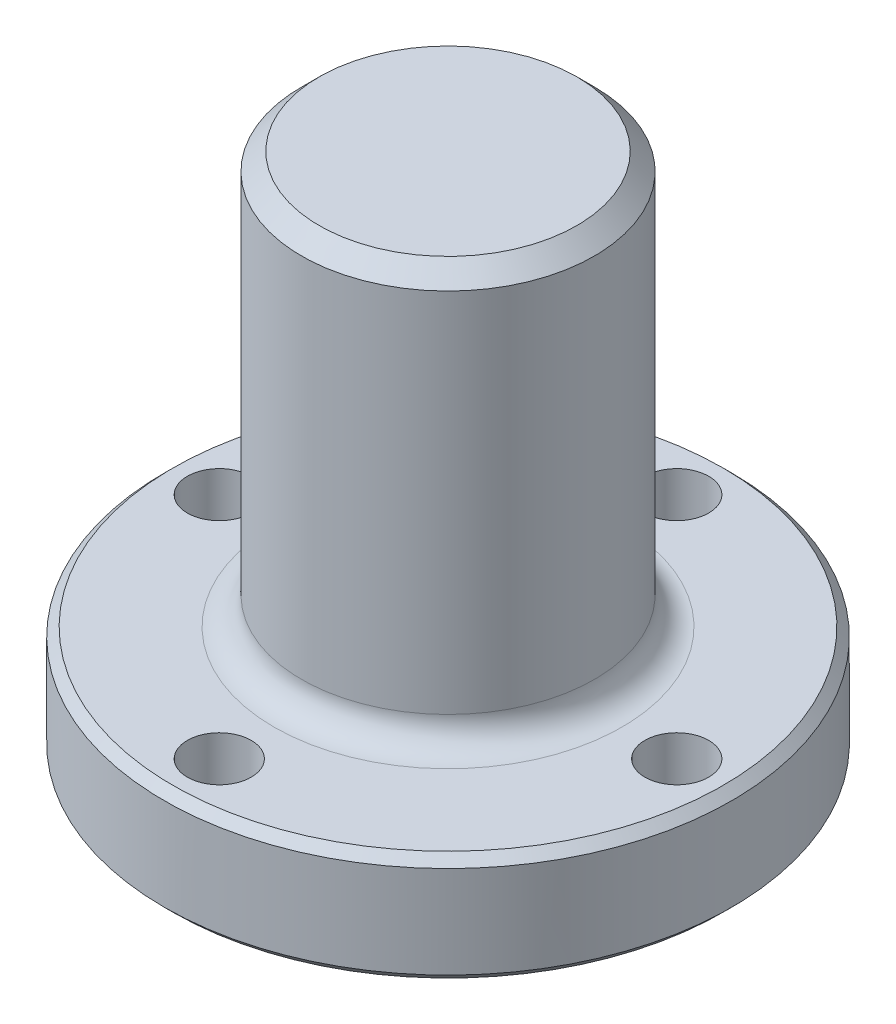
ISO-10303-21;
HEADER;
FILE_DESCRIPTION(('STEP AP214'),'2;1');
FILE_NAME('part.step','',(''),(''),'','','');
FILE_SCHEMA(('AUTOMOTIVE_DESIGN { 1 0 10303 214 1 1 1 1 }'));
ENDSEC;
DATA;
#1=APPLICATION_CONTEXT('core data for automotive mechanical design processes');
#2=APPLICATION_PROTOCOL_DEFINITION('international standard','automotive_design',2000,#1);
#3=PRODUCT_CONTEXT('',#1,'mechanical');
#4=PRODUCT('Part','Part','',(#3));
#5=PRODUCT_RELATED_PRODUCT_CATEGORY('part','',(#4));
#6=PRODUCT_DEFINITION_FORMATION('','',#4);
#7=PRODUCT_DEFINITION_CONTEXT('part definition',#1,'design');
#8=PRODUCT_DEFINITION('design','',#6,#7);
#9=PRODUCT_DEFINITION_SHAPE('','',#8);
#10=(LENGTH_UNIT() NAMED_UNIT(*) SI_UNIT(.MILLI.,.METRE.));
#11=(NAMED_UNIT(*) PLANE_ANGLE_UNIT() SI_UNIT($,.RADIAN.));
#12=(NAMED_UNIT(*) SI_UNIT($,.STERADIAN.) SOLID_ANGLE_UNIT());
#13=UNCERTAINTY_MEASURE_WITH_UNIT(LENGTH_MEASURE(1.E-05),#10,'distance_accuracy_value','');
#14=(GEOMETRIC_REPRESENTATION_CONTEXT(3) GLOBAL_UNCERTAINTY_ASSIGNED_CONTEXT((#13)) GLOBAL_UNIT_ASSIGNED_CONTEXT((#10,
#11,#12)) REPRESENTATION_CONTEXT('',''));
#15=CARTESIAN_POINT('',(0.,0.,0.));
#16=DIRECTION('',(0.,0.,1.));
#17=DIRECTION('',(1.,0.,0.));
#18=AXIS2_PLACEMENT_3D('',#15,#16,#17);
#19=CARTESIAN_POINT('',(0.,-25.0317,0.));
#20=DIRECTION('',(0.,1.,0.));
#21=DIRECTION('',(0.,0.,1.));
#22=AXIS2_PLACEMENT_3D('',#19,#20,#21);
#23=PLANE('',#22);
#24=CARTESIAN_POINT('',(0.,-25.0317,0.));
#25=DIRECTION('',(0.,1.,0.));
#26=DIRECTION('',(0.,0.,1.));
#27=AXIS2_PLACEMENT_3D('',#24,#25,#26);
#28=CIRCLE('',#27,7.95020000000003);
#29=CARTESIAN_POINT('',(0.,-25.0317,7.95020000000003));
#30=VERTEX_POINT('',#29);
#31=EDGE_CURVE('E59',#30,#30,#28,.F.);
#32=ORIENTED_EDGE('',*,*,#31,.T.);
#33=EDGE_LOOP('',(#32));
#34=FACE_BOUND('',#33,.T.);
#35=ADVANCED_FACE('F43',(#34),#23,.F.);
#36=CARTESIAN_POINT('',(0.,-50.4317,0.));
#37=DIRECTION('',(0.,-1.,0.));
#38=DIRECTION('',(0.,0.,-1.));
#39=AXIS2_PLACEMENT_3D('',#36,#37,#38);
#40=CYLINDRICAL_SURFACE('',#39,8.7122);
#41=CARTESIAN_POINT('',(0.,-24.2697,0.));
#42=DIRECTION('',(0.,1.,0.));
#43=DIRECTION('',(0.,0.,1.));
#44=AXIS2_PLACEMENT_3D('',#41,#42,#43);
#45=CIRCLE('',#44,8.7122);
#46=CARTESIAN_POINT('',(0.,-24.2697,8.7122));
#47=VERTEX_POINT('',#46);
#48=EDGE_CURVE('E55',#47,#47,#45,.T.);
#49=ORIENTED_EDGE('',*,*,#48,.T.);
#50=EDGE_LOOP('',(#49));
#51=FACE_BOUND('',#50,.T.);
#52=CARTESIAN_POINT('',(0.,-20.2057,0.));
#53=DIRECTION('',(0.,-1.,0.));
#54=DIRECTION('',(0.,0.,-1.));
#55=AXIS2_PLACEMENT_3D('',#52,#53,#54);
#56=CIRCLE('',#55,8.7122);
#57=CARTESIAN_POINT('',(0.,-20.2057,-8.7122));
#58=VERTEX_POINT('',#57);
#59=EDGE_CURVE('E82',#58,#58,#56,.T.);
#60=ORIENTED_EDGE('',*,*,#59,.T.);
#61=EDGE_LOOP('',(#60));
#62=FACE_BOUND('',#61,.T.);
#63=ADVANCED_FACE('F146',(#51,#62),#40,.T.);
#64=CARTESIAN_POINT('',(-8.7122,-20.2057,0.));
#65=DIRECTION('',(0.,1.,0.));
#66=DIRECTION('',(0.,0.,1.));
#67=AXIS2_PLACEMENT_3D('',#64,#65,#66);
#68=PLANE('',#67);
#69=CARTESIAN_POINT('',(0.,-20.2057,19.8374));
#70=DIRECTION('',(0.,1.,0.));
#71=DIRECTION('',(0.,0.,1.));
#72=AXIS2_PLACEMENT_3D('',#69,#70,#71);
#73=CIRCLE('',#72,2.7686);
#74=CARTESIAN_POINT('',(0.,-20.2057,22.606));
#75=VERTEX_POINT('',#74);
#76=EDGE_CURVE('E91',#75,#75,#73,.F.);
#77=ORIENTED_EDGE('',*,*,#76,.F.);
#78=EDGE_LOOP('',(#77));
#79=FACE_BOUND('',#78,.T.);
#80=CARTESIAN_POINT('',(19.8374,-20.2057,0.));
#81=DIRECTION('',(0.,1.,0.));
#82=DIRECTION('',(0.,0.,1.));
#83=AXIS2_PLACEMENT_3D('',#80,#81,#82);
#84=CIRCLE('',#83,2.7686);
#85=CARTESIAN_POINT('',(19.8374,-20.2057,2.7686));
#86=VERTEX_POINT('',#85);
#87=EDGE_CURVE('E95',#86,#86,#84,.F.);
#88=ORIENTED_EDGE('',*,*,#87,.F.);
#89=EDGE_LOOP('',(#88));
#90=FACE_BOUND('',#89,.T.);
#91=CARTESIAN_POINT('',(0.,-20.2057,-19.8374));
#92=DIRECTION('',(0.,1.,0.));
#93=DIRECTION('',(0.,0.,1.));
#94=AXIS2_PLACEMENT_3D('',#91,#92,#93);
#95=CIRCLE('',#94,2.7686);
#96=CARTESIAN_POINT('',(0.,-20.2057,-17.0688));
#97=VERTEX_POINT('',#96);
#98=EDGE_CURVE('E96',#97,#97,#95,.F.);
#99=ORIENTED_EDGE('',*,*,#98,.F.);
#100=EDGE_LOOP('',(#99));
#101=FACE_BOUND('',#100,.T.);
#102=CARTESIAN_POINT('',(-19.8374,-20.2057,0.));
#103=DIRECTION('',(0.,1.,0.));
#104=DIRECTION('',(0.,0.,1.));
#105=AXIS2_PLACEMENT_3D('',#102,#103,#104);
#106=CIRCLE('',#105,2.7686);
#107=CARTESIAN_POINT('',(-19.8374,-20.2057,2.7686));
#108=VERTEX_POINT('',#107);
#109=EDGE_CURVE('E85',#108,#108,#106,.F.);
#110=ORIENTED_EDGE('',*,*,#109,.F.);
#111=EDGE_LOOP('',(#110));
#112=FACE_BOUND('',#111,.T.);
#113=CARTESIAN_POINT('',(0.,-20.2057,0.));
#114=DIRECTION('',(0.,1.,0.));
#115=DIRECTION('',(0.,0.,1.));
#116=AXIS2_PLACEMENT_3D('',#113,#114,#115);
#117=CIRCLE('',#116,23.8506);
#118=CARTESIAN_POINT('',(0.,-20.2057,23.8506));
#119=VERTEX_POINT('',#118);
#120=EDGE_CURVE('E64',#119,#119,#117,.F.);
#121=ORIENTED_EDGE('',*,*,#120,.T.);
#122=EDGE_LOOP('',(#121));
#123=FACE_BOUND('',#122,.T.);
#124=ORIENTED_EDGE('',*,*,#59,.F.);
#125=EDGE_LOOP('',(#124));
#126=FACE_BOUND('',#125,.T.);
#127=ADVANCED_FACE('F151',(#79,#90,#101,#112,#123,#126),#68,.F.);
#128=CARTESIAN_POINT('',(0.,-50.4317,0.));
#129=DIRECTION('',(0.,-1.,0.));
#130=DIRECTION('',(0.,0.,-1.));
#131=AXIS2_PLACEMENT_3D('',#128,#129,#130);
#132=CYLINDRICAL_SURFACE('',#131,24.6126);
#133=CARTESIAN_POINT('',(0.,-11.4427,0.));
#134=DIRECTION('',(0.,-1.,0.));
#135=DIRECTION('',(0.,0.,-1.));
#136=AXIS2_PLACEMENT_3D('',#133,#134,#135);
#137=CIRCLE('',#136,24.6126);
#138=CARTESIAN_POINT('',(0.,-11.4427,-24.6126));
#139=VERTEX_POINT('',#138);
#140=EDGE_CURVE('E70',#139,#139,#137,.T.);
#141=ORIENTED_EDGE('',*,*,#140,.T.);
#142=EDGE_LOOP('',(#141));
#143=FACE_BOUND('',#142,.T.);
#144=CARTESIAN_POINT('',(0.,-19.4437,0.));
#145=DIRECTION('',(0.,1.,0.));
#146=DIRECTION('',(0.,0.,1.));
#147=AXIS2_PLACEMENT_3D('',#144,#145,#146);
#148=CIRCLE('',#147,24.6126);
#149=CARTESIAN_POINT('',(0.,-19.4437,24.6126));
#150=VERTEX_POINT('',#149);
#151=EDGE_CURVE('E73',#150,#150,#148,.T.);
#152=ORIENTED_EDGE('',*,*,#151,.T.);
#153=EDGE_LOOP('',(#152));
#154=FACE_BOUND('',#153,.T.);
#155=ADVANCED_FACE('F117',(#143,#154),#132,.T.);
#156=CARTESIAN_POINT('',(-24.6126,-10.6807,0.));
#157=DIRECTION('',(0.,-1.,0.));
#158=DIRECTION('',(0.,0.,-1.));
#159=AXIS2_PLACEMENT_3D('',#156,#157,#158);
#160=PLANE('',#159);
#161=CARTESIAN_POINT('',(0.,-10.6807,19.8374));
#162=DIRECTION('',(0.,1.,0.));
#163=DIRECTION('',(0.,0.,1.));
#164=AXIS2_PLACEMENT_3D('',#161,#162,#163);
#165=CIRCLE('',#164,2.7686);
#166=CARTESIAN_POINT('',(0.,-10.6807,22.606));
#167=VERTEX_POINT('',#166);
#168=EDGE_CURVE('E102',#167,#167,#165,.T.);
#169=ORIENTED_EDGE('',*,*,#168,.F.);
#170=EDGE_LOOP('',(#169));
#171=FACE_BOUND('',#170,.T.);
#172=CARTESIAN_POINT('',(19.8374,-10.6807,0.));
#173=DIRECTION('',(0.,1.,0.));
#174=DIRECTION('',(0.,0.,1.));
#175=AXIS2_PLACEMENT_3D('',#172,#173,#174);
#176=CIRCLE('',#175,2.7686);
#177=CARTESIAN_POINT('',(19.8374,-10.6807,2.7686));
#178=VERTEX_POINT('',#177);
#179=EDGE_CURVE('E99',#178,#178,#176,.T.);
#180=ORIENTED_EDGE('',*,*,#179,.F.);
#181=EDGE_LOOP('',(#180));
#182=FACE_BOUND('',#181,.T.);
#183=CARTESIAN_POINT('',(0.,-10.6807,-19.8374));
#184=DIRECTION('',(0.,1.,0.));
#185=DIRECTION('',(0.,0.,1.));
#186=AXIS2_PLACEMENT_3D('',#183,#184,#185);
#187=CIRCLE('',#186,2.7686);
#188=CARTESIAN_POINT('',(0.,-10.6807,-17.0688));
#189=VERTEX_POINT('',#188);
#190=EDGE_CURVE('E92',#189,#189,#187,.T.);
#191=ORIENTED_EDGE('',*,*,#190,.F.);
#192=EDGE_LOOP('',(#191));
#193=FACE_BOUND('',#192,.T.);
#194=CARTESIAN_POINT('',(-19.8374,-10.6807,0.));
#195=DIRECTION('',(0.,1.,0.));
#196=DIRECTION('',(0.,0.,1.));
#197=AXIS2_PLACEMENT_3D('',#194,#195,#196);
#198=CIRCLE('',#197,2.7686);
#199=CARTESIAN_POINT('',(-19.8374,-10.6807,2.7686));
#200=VERTEX_POINT('',#199);
#201=EDGE_CURVE('E88',#200,#200,#198,.T.);
#202=ORIENTED_EDGE('',*,*,#201,.F.);
#203=EDGE_LOOP('',(#202));
#204=FACE_BOUND('',#203,.T.);
#205=CARTESIAN_POINT('',(0.,-10.6807,0.));
#206=DIRECTION('',(0.,-1.,0.));
#207=DIRECTION('',(0.,0.,-1.));
#208=AXIS2_PLACEMENT_3D('',#205,#206,#207);
#209=CIRCLE('',#208,23.8506);
#210=CARTESIAN_POINT('',(0.,-10.6807,-23.8506));
#211=VERTEX_POINT('',#210);
#212=EDGE_CURVE('E67',#211,#211,#209,.F.);
#213=ORIENTED_EDGE('',*,*,#212,.T.);
#214=EDGE_LOOP('',(#213));
#215=FACE_BOUND('',#214,.T.);
#216=CARTESIAN_POINT('',(0.,-10.6807,0.));
#217=DIRECTION('',(0.,-1.,0.));
#218=DIRECTION('',(0.,0.,-1.));
#219=AXIS2_PLACEMENT_3D('',#216,#217,#218);
#220=CIRCLE('',#219,15.0876);
#221=CARTESIAN_POINT('',(0.,-10.6807,-15.0876));
#222=VERTEX_POINT('',#221);
#223=EDGE_CURVE('E79',#222,#222,#220,.T.);
#224=ORIENTED_EDGE('',*,*,#223,.T.);
#225=EDGE_LOOP('',(#224));
#226=FACE_BOUND('',#225,.T.);
#227=ADVANCED_FACE('F113',(#171,#182,#193,#204,#215,#226),#160,.F.);
#228=CARTESIAN_POINT('',(0.,-50.4317,0.));
#229=DIRECTION('',(0.,-1.,0.));
#230=DIRECTION('',(0.,0.,-1.));
#231=AXIS2_PLACEMENT_3D('',#228,#229,#230);
#232=CYLINDRICAL_SURFACE('',#231,12.7);
#233=CARTESIAN_POINT('',(0.,23.5077,0.));
#234=DIRECTION('',(0.,-1.,0.));
#235=DIRECTION('',(0.,0.,-1.));
#236=AXIS2_PLACEMENT_3D('',#233,#234,#235);
#237=CIRCLE('',#236,12.7);
#238=CARTESIAN_POINT('',(0.,23.5077,-12.7));
#239=VERTEX_POINT('',#238);
#240=EDGE_CURVE('E51',#239,#239,#237,.T.);
#241=ORIENTED_EDGE('',*,*,#240,.T.);
#242=EDGE_LOOP('',(#241));
#243=FACE_BOUND('',#242,.T.);
#244=CARTESIAN_POINT('',(0.,-8.2931,0.));
#245=DIRECTION('',(0.,-1.,0.));
#246=DIRECTION('',(0.,0.,-1.));
#247=AXIS2_PLACEMENT_3D('',#244,#245,#246);
#248=CIRCLE('',#247,12.7);
#249=CARTESIAN_POINT('',(0.,-8.2931,-12.7));
#250=VERTEX_POINT('',#249);
#251=EDGE_CURVE('E76',#250,#250,#248,.F.);
#252=ORIENTED_EDGE('',*,*,#251,.T.);
#253=EDGE_LOOP('',(#252));
#254=FACE_BOUND('',#253,.T.);
#255=ADVANCED_FACE('F116',(#243,#254),#232,.T.);
#256=CARTESIAN_POINT('',(-12.7,25.0317,0.));
#257=DIRECTION('',(0.,-1.,0.));
#258=DIRECTION('',(0.,0.,-1.));
#259=AXIS2_PLACEMENT_3D('',#256,#257,#258);
#260=PLANE('',#259);
#261=CARTESIAN_POINT('',(0.,25.0317,0.));
#262=DIRECTION('',(0.,-1.,0.));
#263=DIRECTION('',(0.,0.,-1.));
#264=AXIS2_PLACEMENT_3D('',#261,#262,#263);
#265=CIRCLE('',#264,11.176);
#266=CARTESIAN_POINT('',(0.,25.0317,-11.176));
#267=VERTEX_POINT('',#266);
#268=EDGE_CURVE('E10',#267,#267,#265,.F.);
#269=ORIENTED_EDGE('',*,*,#268,.T.);
#270=EDGE_LOOP('',(#269));
#271=FACE_BOUND('',#270,.T.);
#272=ADVANCED_FACE('F132',(#271),#260,.F.);
#273=CARTESIAN_POINT('',(0.,-8.2931,0.));
#274=DIRECTION('',(0.,-1.,0.));
#275=DIRECTION('',(0.,0.,-1.));
#276=AXIS2_PLACEMENT_3D('',#273,#274,#275);
#277=TOROIDAL_SURFACE('',#276,15.0876,2.3876);
#278=ORIENTED_EDGE('',*,*,#251,.F.);
#279=EDGE_LOOP('',(#278));
#280=FACE_BOUND('',#279,.T.);
#281=ORIENTED_EDGE('',*,*,#223,.F.);
#282=EDGE_LOOP('',(#281));
#283=FACE_BOUND('',#282,.T.);
#284=ADVANCED_FACE('F129',(#280,#283),#277,.F.);
#285=CARTESIAN_POINT('',(0.,-11.4427,0.));
#286=DIRECTION('',(0.,-1.,0.));
#287=DIRECTION('',(0.,0.,-1.));
#288=AXIS2_PLACEMENT_3D('',#285,#286,#287);
#289=CONICAL_SURFACE('',#288,24.6126,0.785398163397457);
#290=ORIENTED_EDGE('',*,*,#212,.F.);
#291=EDGE_LOOP('',(#290));
#292=FACE_BOUND('',#291,.T.);
#293=ORIENTED_EDGE('',*,*,#140,.F.);
#294=EDGE_LOOP('',(#293));
#295=FACE_BOUND('',#294,.T.);
#296=ADVANCED_FACE('F131',(#292,#295),#289,.T.);
#297=CARTESIAN_POINT('',(0.,-20.2057,0.));
#298=DIRECTION('',(0.,1.,0.));
#299=DIRECTION('',(0.,0.,1.));
#300=AXIS2_PLACEMENT_3D('',#297,#298,#299);
#301=CONICAL_SURFACE('',#300,23.8506,0.785398163397432);
#302=ORIENTED_EDGE('',*,*,#151,.F.);
#303=EDGE_LOOP('',(#302));
#304=FACE_BOUND('',#303,.T.);
#305=ORIENTED_EDGE('',*,*,#120,.F.);
#306=EDGE_LOOP('',(#305));
#307=FACE_BOUND('',#306,.T.);
#308=ADVANCED_FACE('F139',(#304,#307),#301,.T.);
#309=CARTESIAN_POINT('',(0.,-25.0317,0.));
#310=DIRECTION('',(0.,1.,0.));
#311=DIRECTION('',(0.,0.,1.));
#312=AXIS2_PLACEMENT_3D('',#309,#310,#311);
#313=CONICAL_SURFACE('',#312,7.95020000000003,0.785398163397446);
#314=ORIENTED_EDGE('',*,*,#48,.F.);
#315=EDGE_LOOP('',(#314));
#316=FACE_BOUND('',#315,.T.);
#317=ORIENTED_EDGE('',*,*,#31,.F.);
#318=EDGE_LOOP('',(#317));
#319=FACE_BOUND('',#318,.T.);
#320=ADVANCED_FACE('F212',(#316,#319),#313,.T.);
#321=CARTESIAN_POINT('',(0.,23.5077,0.));
#322=DIRECTION('',(0.,-1.,0.));
#323=DIRECTION('',(0.,0.,-1.));
#324=AXIS2_PLACEMENT_3D('',#321,#322,#323);
#325=CONICAL_SURFACE('',#324,12.7,0.785398163397454);
#326=ORIENTED_EDGE('',*,*,#268,.F.);
#327=EDGE_LOOP('',(#326));
#328=FACE_BOUND('',#327,.T.);
#329=ORIENTED_EDGE('',*,*,#240,.F.);
#330=EDGE_LOOP('',(#329));
#331=FACE_BOUND('',#330,.T.);
#332=ADVANCED_FACE('F46',(#328,#331),#325,.T.);
#333=CARTESIAN_POINT('',(-19.8374,-25.0327,0.));
#334=DIRECTION('',(0.,1.,0.));
#335=DIRECTION('',(0.,0.,1.));
#336=AXIS2_PLACEMENT_3D('',#333,#334,#335);
#337=CYLINDRICAL_SURFACE('',#336,2.7686);
#338=ORIENTED_EDGE('',*,*,#201,.T.);
#339=EDGE_LOOP('',(#338));
#340=FACE_BOUND('',#339,.T.);
#341=ORIENTED_EDGE('',*,*,#109,.T.);
#342=EDGE_LOOP('',(#341));
#343=FACE_BOUND('',#342,.T.);
#344=ADVANCED_FACE('F163',(#340,#343),#337,.F.);
#345=CARTESIAN_POINT('',(0.,-25.0327,-19.8374));
#346=DIRECTION('',(0.,1.,0.));
#347=DIRECTION('',(0.,0.,1.));
#348=AXIS2_PLACEMENT_3D('',#345,#346,#347);
#349=CYLINDRICAL_SURFACE('',#348,2.7686);
#350=ORIENTED_EDGE('',*,*,#190,.T.);
#351=EDGE_LOOP('',(#350));
#352=FACE_BOUND('',#351,.T.);
#353=ORIENTED_EDGE('',*,*,#98,.T.);
#354=EDGE_LOOP('',(#353));
#355=FACE_BOUND('',#354,.T.);
#356=ADVANCED_FACE('F166',(#352,#355),#349,.F.);
#357=CARTESIAN_POINT('',(19.8374,-25.0327,0.));
#358=DIRECTION('',(0.,1.,0.));
#359=DIRECTION('',(0.,0.,1.));
#360=AXIS2_PLACEMENT_3D('',#357,#358,#359);
#361=CYLINDRICAL_SURFACE('',#360,2.7686);
#362=ORIENTED_EDGE('',*,*,#179,.T.);
#363=EDGE_LOOP('',(#362));
#364=FACE_BOUND('',#363,.T.);
#365=ORIENTED_EDGE('',*,*,#87,.T.);
#366=EDGE_LOOP('',(#365));
#367=FACE_BOUND('',#366,.T.);
#368=ADVANCED_FACE('F170',(#364,#367),#361,.F.);
#369=CARTESIAN_POINT('',(0.,-25.0327,19.8374));
#370=DIRECTION('',(0.,1.,0.));
#371=DIRECTION('',(0.,0.,1.));
#372=AXIS2_PLACEMENT_3D('',#369,#370,#371);
#373=CYLINDRICAL_SURFACE('',#372,2.7686);
#374=ORIENTED_EDGE('',*,*,#168,.T.);
#375=EDGE_LOOP('',(#374));
#376=FACE_BOUND('',#375,.T.);
#377=ORIENTED_EDGE('',*,*,#76,.T.);
#378=EDGE_LOOP('',(#377));
#379=FACE_BOUND('',#378,.T.);
#380=ADVANCED_FACE('F110',(#376,#379),#373,.F.);
#381=CLOSED_SHELL('',(#35,#63,#127,#155,#227,#255,#272,#284,#296,#308,#320,#332,#344,#356,#368,#380));
#382=MANIFOLD_SOLID_BREP('B2',#381);
#383=ADVANCED_BREP_SHAPE_REPRESENTATION('',(#18,#382),#14);
#384=SHAPE_DEFINITION_REPRESENTATION(#9,#383);
ENDSEC;
END-ISO-10303-21;
